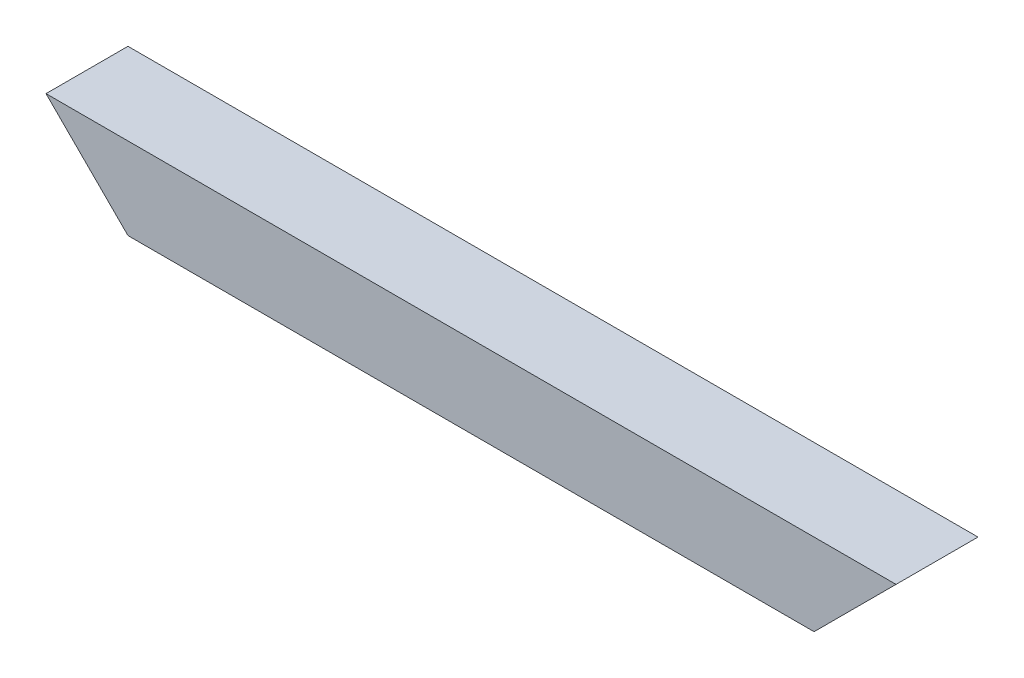
ISO-10303-21;
HEADER;
FILE_DESCRIPTION(('STEP AP214'),'2;1');
FILE_NAME('part.step','',(''),(''),'','','');
FILE_SCHEMA(('AUTOMOTIVE_DESIGN { 1 0 10303 214 1 1 1 1 }'));
ENDSEC;
DATA;
#1=APPLICATION_CONTEXT('core data for automotive mechanical design processes');
#2=APPLICATION_PROTOCOL_DEFINITION('international standard','automotive_design',2000,#1);
#3=PRODUCT_CONTEXT('',#1,'mechanical');
#4=PRODUCT('Part','Part','',(#3));
#5=PRODUCT_RELATED_PRODUCT_CATEGORY('part','',(#4));
#6=PRODUCT_DEFINITION_FORMATION('','',#4);
#7=PRODUCT_DEFINITION_CONTEXT('part definition',#1,'design');
#8=PRODUCT_DEFINITION('design','',#6,#7);
#9=PRODUCT_DEFINITION_SHAPE('','',#8);
#10=(LENGTH_UNIT() NAMED_UNIT(*) SI_UNIT(.MILLI.,.METRE.));
#11=(NAMED_UNIT(*) PLANE_ANGLE_UNIT() SI_UNIT($,.RADIAN.));
#12=(NAMED_UNIT(*) SI_UNIT($,.STERADIAN.) SOLID_ANGLE_UNIT());
#13=UNCERTAINTY_MEASURE_WITH_UNIT(LENGTH_MEASURE(1.E-05),#10,'distance_accuracy_value','');
#14=(GEOMETRIC_REPRESENTATION_CONTEXT(3) GLOBAL_UNCERTAINTY_ASSIGNED_CONTEXT((#13)) GLOBAL_UNIT_ASSIGNED_CONTEXT((#10,
#11,#12)) REPRESENTATION_CONTEXT('',''));
#15=CARTESIAN_POINT('',(0.,0.,0.));
#16=DIRECTION('',(0.,0.,1.));
#17=DIRECTION('',(1.,0.,0.));
#18=AXIS2_PLACEMENT_3D('',#15,#16,#17);
#19=CARTESIAN_POINT('',(395.1312646,-38.1,0.));
#20=DIRECTION('',(0.,1.,0.));
#21=DIRECTION('',(0.,0.,1.));
#22=AXIS2_PLACEMENT_3D('',#19,#20,#21);
#23=PLANE('',#22);
#24=DIRECTION('',(0.,0.,-1.));
#25=VECTOR('',#24,1.);
#26=CARTESIAN_POINT('',(357.0312646,-38.1,498.485105507795));
#27=LINE('',#26,#25);
#28=CARTESIAN_POINT('',(357.0312646,-38.1,0.));
#29=VERTEX_POINT('',#28);
#30=CARTESIAN_POINT('',(357.0312646,-38.1,-38.1));
#31=VERTEX_POINT('',#30);
#32=EDGE_CURVE('E59',#29,#31,#27,.T.);
#33=ORIENTED_EDGE('',*,*,#32,.F.);
#34=DIRECTION('',(-1.,0.,0.));
#35=VECTOR('',#34,1.);
#36=CARTESIAN_POINT('',(395.1312646,-38.1,0.));
#37=LINE('',#36,#35);
#38=CARTESIAN_POINT('',(38.1,-38.1,0.));
#39=VERTEX_POINT('',#38);
#40=EDGE_CURVE('E65',#29,#39,#37,.T.);
#41=ORIENTED_EDGE('',*,*,#40,.T.);
#42=DIRECTION('',(0.,0.,-1.));
#43=VECTOR('',#42,1.);
#44=CARTESIAN_POINT('',(38.1,-38.1,498.485105507795));
#45=LINE('',#44,#43);
#46=CARTESIAN_POINT('',(38.1,-38.1,-38.1));
#47=VERTEX_POINT('',#46);
#48=EDGE_CURVE('E99',#39,#47,#45,.T.);
#49=ORIENTED_EDGE('',*,*,#48,.T.);
#50=DIRECTION('',(-1.,0.,0.));
#51=VECTOR('',#50,1.);
#52=CARTESIAN_POINT('',(395.1312646,-38.1,-38.1));
#53=LINE('',#52,#51);
#54=EDGE_CURVE('E107',#31,#47,#53,.T.);
#55=ORIENTED_EDGE('',*,*,#54,.F.);
#56=EDGE_LOOP('',(#33,#41,#49,#55));
#57=FACE_BOUND('',#56,.T.);
#58=ADVANCED_FACE('F43',(#57),#23,.F.);
#59=CARTESIAN_POINT('',(395.1312646,0.,0.));
#60=DIRECTION('',(0.,0.,-1.));
#61=DIRECTION('',(0.,1.,0.));
#62=AXIS2_PLACEMENT_3D('',#59,#60,#61);
#63=PLANE('',#62);
#64=ORIENTED_EDGE('',*,*,#40,.F.);
#65=DIRECTION('',(0.707106781186548,0.707106781186547,0.));
#66=VECTOR('',#65,1.);
#67=CARTESIAN_POINT('',(395.1312646,0.,0.));
#68=LINE('',#67,#66);
#69=CARTESIAN_POINT('',(395.1312646,0.,0.));
#70=VERTEX_POINT('',#69);
#71=EDGE_CURVE('E86',#29,#70,#68,.T.);
#72=ORIENTED_EDGE('',*,*,#71,.T.);
#73=DIRECTION('',(-1.,0.,0.));
#74=VECTOR('',#73,1.);
#75=CARTESIAN_POINT('',(395.1312646,0.,0.));
#76=LINE('',#75,#74);
#77=CARTESIAN_POINT('',(0.,0.,0.));
#78=VERTEX_POINT('',#77);
#79=EDGE_CURVE('E92',#70,#78,#76,.T.);
#80=ORIENTED_EDGE('',*,*,#79,.T.);
#81=DIRECTION('',(-0.707106781186547,0.707106781186547,0.));
#82=VECTOR('',#81,1.);
#83=CARTESIAN_POINT('',(197.5656323,-197.5656323,0.));
#84=LINE('',#83,#82);
#85=EDGE_CURVE('E123',#39,#78,#84,.T.);
#86=ORIENTED_EDGE('',*,*,#85,.F.);
#87=EDGE_LOOP('',(#64,#72,#80,#86));
#88=FACE_BOUND('',#87,.T.);
#89=ADVANCED_FACE('F45',(#88),#63,.F.);
#90=CARTESIAN_POINT('',(395.1312646,0.,-38.1));
#91=DIRECTION('',(0.,0.,1.));
#92=DIRECTION('',(0.,-1.,0.));
#93=AXIS2_PLACEMENT_3D('',#90,#91,#92);
#94=PLANE('',#93);
#95=DIRECTION('',(-1.,0.,0.));
#96=VECTOR('',#95,1.);
#97=CARTESIAN_POINT('',(395.1312646,0.,-38.1));
#98=LINE('',#97,#96);
#99=CARTESIAN_POINT('',(395.1312646,0.,-38.1));
#100=VERTEX_POINT('',#99);
#101=CARTESIAN_POINT('',(0.,0.,-38.1));
#102=VERTEX_POINT('',#101);
#103=EDGE_CURVE('E104',#100,#102,#98,.T.);
#104=ORIENTED_EDGE('',*,*,#103,.F.);
#105=DIRECTION('',(-0.707106781186548,-0.707106781186547,0.));
#106=VECTOR('',#105,1.);
#107=CARTESIAN_POINT('',(395.1312646,0.,-38.1));
#108=LINE('',#107,#106);
#109=EDGE_CURVE('E11',#100,#31,#108,.T.);
#110=ORIENTED_EDGE('',*,*,#109,.T.);
#111=ORIENTED_EDGE('',*,*,#54,.T.);
#112=DIRECTION('',(0.707106781186547,-0.707106781186547,0.));
#113=VECTOR('',#112,1.);
#114=CARTESIAN_POINT('',(197.5656323,-197.5656323,-38.1));
#115=LINE('',#114,#113);
#116=EDGE_CURVE('E52',#102,#47,#115,.T.);
#117=ORIENTED_EDGE('',*,*,#116,.F.);
#118=EDGE_LOOP('',(#104,#110,#111,#117));
#119=FACE_BOUND('',#118,.T.);
#120=ADVANCED_FACE('F120',(#119),#94,.F.);
#121=CARTESIAN_POINT('',(395.1312646,0.,0.));
#122=DIRECTION('',(0.,-1.,0.));
#123=DIRECTION('',(0.,0.,-1.));
#124=AXIS2_PLACEMENT_3D('',#121,#122,#123);
#125=PLANE('',#124);
#126=DIRECTION('',(0.,0.,1.));
#127=VECTOR('',#126,1.);
#128=CARTESIAN_POINT('',(0.,0.,0.));
#129=LINE('',#128,#127);
#130=EDGE_CURVE('E93',#102,#78,#129,.T.);
#131=ORIENTED_EDGE('',*,*,#130,.T.);
#132=ORIENTED_EDGE('',*,*,#79,.F.);
#133=DIRECTION('',(0.,0.,1.));
#134=VECTOR('',#133,1.);
#135=CARTESIAN_POINT('',(395.1312646,0.,0.));
#136=LINE('',#135,#134);
#137=EDGE_CURVE('E83',#100,#70,#136,.T.);
#138=ORIENTED_EDGE('',*,*,#137,.F.);
#139=ORIENTED_EDGE('',*,*,#103,.T.);
#140=EDGE_LOOP('',(#131,#132,#138,#139));
#141=FACE_BOUND('',#140,.T.);
#142=ADVANCED_FACE('F101',(#141),#125,.F.);
#143=CARTESIAN_POINT('',(38.1,-38.1,498.485105507795));
#144=DIRECTION('',(-0.707106781186547,-0.707106781186547,0.));
#145=DIRECTION('',(0.707106781186548,-0.707106781186548,0.));
#146=AXIS2_PLACEMENT_3D('',#143,#144,#145);
#147=PLANE('',#146);
#148=ORIENTED_EDGE('',*,*,#48,.F.);
#149=ORIENTED_EDGE('',*,*,#85,.T.);
#150=ORIENTED_EDGE('',*,*,#130,.F.);
#151=ORIENTED_EDGE('',*,*,#116,.T.);
#152=EDGE_LOOP('',(#148,#149,#150,#151));
#153=FACE_BOUND('',#152,.T.);
#154=ADVANCED_FACE('F118',(#153),#147,.T.);
#155=CARTESIAN_POINT('',(357.0312646,-38.1,498.485105507795));
#156=DIRECTION('',(-0.707106781186547,0.707106781186548,0.));
#157=DIRECTION('',(-0.707106781186548,-0.707106781186547,0.));
#158=AXIS2_PLACEMENT_3D('',#155,#156,#157);
#159=PLANE('',#158);
#160=ORIENTED_EDGE('',*,*,#71,.F.);
#161=ORIENTED_EDGE('',*,*,#32,.T.);
#162=ORIENTED_EDGE('',*,*,#109,.F.);
#163=ORIENTED_EDGE('',*,*,#137,.T.);
#164=EDGE_LOOP('',(#160,#161,#162,#163));
#165=FACE_BOUND('',#164,.T.);
#166=ADVANCED_FACE('F85',(#165),#159,.F.);
#167=CLOSED_SHELL('',(#58,#89,#120,#142,#154,#166));
#168=MANIFOLD_SOLID_BREP('B2',#167);
#169=ADVANCED_BREP_SHAPE_REPRESENTATION('',(#18,#168),#14);
#170=SHAPE_DEFINITION_REPRESENTATION(#9,#169);
ENDSEC;
END-ISO-10303-21;
